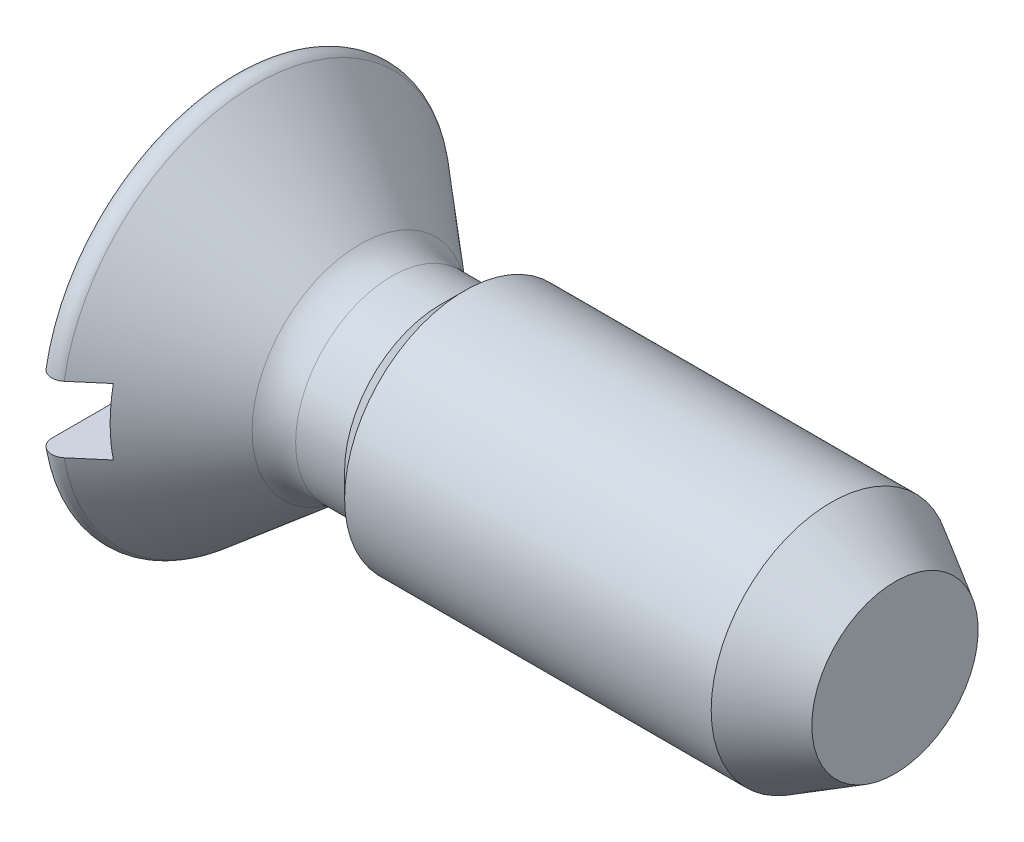
ISO-10303-21;
HEADER;
FILE_DESCRIPTION(('STEP AP214'),'2;1');
FILE_NAME('part.step','',(''),(''),'','','');
FILE_SCHEMA(('AUTOMOTIVE_DESIGN { 1 0 10303 214 1 1 1 1 }'));
ENDSEC;
DATA;
#1=APPLICATION_CONTEXT('core data for automotive mechanical design processes');
#2=APPLICATION_PROTOCOL_DEFINITION('international standard','automotive_design',2000,#1);
#3=PRODUCT_CONTEXT('',#1,'mechanical');
#4=PRODUCT('Part','Part','',(#3));
#5=PRODUCT_RELATED_PRODUCT_CATEGORY('part','',(#4));
#6=PRODUCT_DEFINITION_FORMATION('','',#4);
#7=PRODUCT_DEFINITION_CONTEXT('part definition',#1,'design');
#8=PRODUCT_DEFINITION('design','',#6,#7);
#9=PRODUCT_DEFINITION_SHAPE('','',#8);
#10=(LENGTH_UNIT() NAMED_UNIT(*) SI_UNIT(.MILLI.,.METRE.));
#11=(NAMED_UNIT(*) PLANE_ANGLE_UNIT() SI_UNIT($,.RADIAN.));
#12=(NAMED_UNIT(*) SI_UNIT($,.STERADIAN.) SOLID_ANGLE_UNIT());
#13=UNCERTAINTY_MEASURE_WITH_UNIT(LENGTH_MEASURE(1.E-05),#10,'distance_accuracy_value','');
#14=(GEOMETRIC_REPRESENTATION_CONTEXT(3) GLOBAL_UNCERTAINTY_ASSIGNED_CONTEXT((#13)) GLOBAL_UNIT_ASSIGNED_CONTEXT((#10,
#11,#12)) REPRESENTATION_CONTEXT('',''));
#15=CARTESIAN_POINT('',(0.,0.,0.));
#16=DIRECTION('',(0.,0.,1.));
#17=DIRECTION('',(1.,0.,0.));
#18=AXIS2_PLACEMENT_3D('',#15,#16,#17);
#19=CARTESIAN_POINT('',(0.,0.,0.));
#20=DIRECTION('',(-1.,0.,0.));
#21=DIRECTION('',(0.,0.,1.));
#22=AXIS2_PLACEMENT_3D('',#19,#20,#21);
#23=CYLINDRICAL_SURFACE('',#22,1.45);
#24=CARTESIAN_POINT('',(2.8,0.,0.));
#25=DIRECTION('',(-1.,0.,0.));
#26=DIRECTION('',(0.,0.,1.));
#27=AXIS2_PLACEMENT_3D('',#24,#25,#26);
#28=CIRCLE('',#27,1.45);
#29=CARTESIAN_POINT('',(2.8,0.,1.45));
#30=VERTEX_POINT('',#29);
#31=EDGE_CURVE('E207',#30,#30,#28,.T.);
#32=ORIENTED_EDGE('',*,*,#31,.F.);
#33=EDGE_LOOP('',(#32));
#34=FACE_BOUND('',#33,.T.);
#35=CARTESIAN_POINT('',(7.22923739063184,0.,0.));
#36=DIRECTION('',(-1.,0.,0.));
#37=DIRECTION('',(0.,0.,1.));
#38=AXIS2_PLACEMENT_3D('',#35,#36,#37);
#39=CIRCLE('',#38,1.45);
#40=CARTESIAN_POINT('',(7.22923739063184,0.,1.45));
#41=VERTEX_POINT('',#40);
#42=EDGE_CURVE('E322',#41,#41,#39,.T.);
#43=ORIENTED_EDGE('',*,*,#42,.T.);
#44=EDGE_LOOP('',(#43));
#45=FACE_BOUND('',#44,.T.);
#46=ADVANCED_FACE('F68',(#34,#45),#23,.T.);
#47=CARTESIAN_POINT('',(0.17,0.,0.));
#48=DIRECTION('',(-1.,0.,0.));
#49=DIRECTION('',(0.,0.,1.));
#50=AXIS2_PLACEMENT_3D('',#47,#48,#49);
#51=TOROIDAL_SURFACE('',#50,2.22190319651476,0.17);
#52=CARTESIAN_POINT('',(0.279273893646712,0.,0.));
#53=DIRECTION('',(-1.,0.,0.));
#54=DIRECTION('',(0.,0.,1.));
#55=AXIS2_PLACEMENT_3D('',#52,#53,#54);
#56=CIRCLE('',#55,2.35213075184498);
#57=CARTESIAN_POINT('',(0.279273893646822,0.4,2.31786951180939));
#58=VERTEX_POINT('',#57);
#59=CARTESIAN_POINT('',(0.279273893646712,0.4,-2.31786951180925));
#60=VERTEX_POINT('',#59);
#61=EDGE_CURVE('E195',#58,#60,#56,.T.);
#62=ORIENTED_EDGE('',*,*,#61,.T.);
#63=CARTESIAN_POINT('',(0.0889384961785329,0.4,-2.33735245315841));
#64=CARTESIAN_POINT('',(0.0805263654139206,0.4,-2.33272221499589));
#65=CARTESIAN_POINT('',(0.072502803363843,0.4,-2.32737032643383));
#66=CARTESIAN_POINT('',(0.0574658225928772,0.4,-2.31538584476536));
#67=CARTESIAN_POINT('',(0.0504537835014888,0.4,-2.30875153085024));
#68=CARTESIAN_POINT('',(0.0376460763453105,0.4,-2.29441026275131));
#69=CARTESIAN_POINT('',(0.0318490873155328,0.4,-2.28670448875177));
#70=CARTESIAN_POINT('',(0.0216166901804722,0.4,-2.27044028115566));
#71=CARTESIAN_POINT('',(0.0171809523346821,0.4,-2.26188205471794));
#72=CARTESIAN_POINT('',(0.00974088996505031,0.4,-2.24405535282024));
#73=CARTESIAN_POINT('',(0.00675261357868859,0.4,-2.23478018033097));
#74=CARTESIAN_POINT('',(0.00235416229051626,0.4,-2.21586245858979));
#75=CARTESIAN_POINT('',(0.000944168939626591,0.4,-2.20621986720534));
#76=CARTESIAN_POINT('',(-0.000271469793120033,0.4,-2.18671389355607));
#77=CARTESIAN_POINT('',(-5.7032249274555E-05,0.4,-2.17684925582097));
#78=CARTESIAN_POINT('',(0.00201640846432935,0.4,-2.15729406609383));
#79=CARTESIAN_POINT('',(0.00387548203202619,0.4,-2.14760352157189));
#80=CARTESIAN_POINT('',(0.00920170433124389,0.4,-2.12862529165873));
#81=CARTESIAN_POINT('',(0.0126763545484518,0.4,-2.11933970898794));
#82=CARTESIAN_POINT('',(0.0211446700937419,0.4,-2.10148865373612));
#83=CARTESIAN_POINT('',(0.0261383085428652,0.4,-2.09292316841618));
#84=CARTESIAN_POINT('',(0.0374749882434484,0.4,-2.07681720987948));
#85=CARTESIAN_POINT('',(0.0438093629401025,0.4,-2.06927064040772));
#86=CARTESIAN_POINT('',(0.0576733772891683,0.4,-2.05536898482295));
#87=CARTESIAN_POINT('',(0.0652029204841273,0.4,-2.04901380264784));
#88=CARTESIAN_POINT('',(0.0811188303905905,0.4,-2.03778408507649));
#89=CARTESIAN_POINT('',(0.0894899345399597,0.4,-2.03288792338717));
#90=CARTESIAN_POINT('',(0.106946537617095,0.4,-2.02460018274473));
#91=CARTESIAN_POINT('',(0.116031957326244,0.4,-2.02120843722602));
#92=CARTESIAN_POINT('',(0.134484532048687,0.4,-2.01608678532061));
#93=CARTESIAN_POINT('',(0.143843748365539,0.4,-2.01432825792454));
#94=CARTESIAN_POINT('',(0.162724652963433,0.4,-2.01242635488956));
#95=CARTESIAN_POINT('',(0.172246328895226,0.4,-2.01228285702835));
#96=CARTESIAN_POINT('',(0.191073946256289,0.4,-2.01360825815497));
#97=CARTESIAN_POINT('',(0.200381105718333,0.4,-2.01505994611846));
#98=CARTESIAN_POINT('',(0.218620285805626,0.4,-2.01950203041738));
#99=CARTESIAN_POINT('',(0.227552308041324,0.4,-2.02249242014648));
#100=CARTESIAN_POINT('',(0.244812707641328,0.4,-2.02992704705099));
#101=CARTESIAN_POINT('',(0.253139669277806,0.4,-2.03437456777238));
#102=CARTESIAN_POINT('',(0.268942283765914,0.4,-2.04458633866557));
#103=CARTESIAN_POINT('',(0.276417884388006,0.4,-2.05035066955627));
#104=CARTESIAN_POINT('',(0.290417775919704,0.4,-2.06311463419677));
#105=CARTESIAN_POINT('',(0.296927551771122,0.4,-2.0701301832642));
#106=CARTESIAN_POINT('',(0.308702093427808,0.4,-2.0851378411088));
#107=CARTESIAN_POINT('',(0.313966743727458,0.4,-2.09313004038192));
#108=CARTESIAN_POINT('',(0.323200485377303,0.4,-2.11001835691443));
#109=CARTESIAN_POINT('',(0.327144587019896,0.4,-2.11892814024014));
#110=CARTESIAN_POINT('',(0.333503876746316,0.4,-2.13727765237194));
#111=CARTESIAN_POINT('',(0.335918939472825,0.4,-2.1467174245598));
#112=CARTESIAN_POINT('',(0.339180053297898,0.4,-2.1659961445512));
#113=CARTESIAN_POINT('',(0.340004421726993,0.4,-2.17583876618829));
#114=CARTESIAN_POINT('',(0.339995542141485,0.4,-2.19552353828602));
#115=CARTESIAN_POINT('',(0.339162238148206,0.4,-2.20536568871952));
#116=CARTESIAN_POINT('',(0.33585124735711,0.4,-2.22480511429204));
#117=CARTESIAN_POINT('',(0.333367861166056,0.4,-2.234401420552));
#118=CARTESIAN_POINT('',(0.326813923462802,0.4,-2.25303623180166));
#119=CARTESIAN_POINT('',(0.322743408361803,0.4,-2.26207474958238));
#120=CARTESIAN_POINT('',(0.313157151172355,0.4,-2.27926625050789));
#121=CARTESIAN_POINT('',(0.307651848294169,0.4,-2.28742505166302));
#122=CARTESIAN_POINT('',(0.295331954029087,0.4,-2.30268608802754));
#123=CARTESIAN_POINT('',(0.288517452377763,0.4,-2.30978839559233));
#124=CARTESIAN_POINT('',(0.273871380749755,0.4,-2.32263037095252));
#125=CARTESIAN_POINT('',(0.266054946288835,0.4,-2.32838729878652));
#126=CARTESIAN_POINT('',(0.249555458103697,0.4,-2.33848453643122));
#127=CARTESIAN_POINT('',(0.240872510950785,0.4,-2.34282502016891));
#128=CARTESIAN_POINT('',(0.223020371649629,0.4,-2.34990283731963));
#129=CARTESIAN_POINT('',(0.213859929837689,0.4,-2.35266225138013));
#130=CARTESIAN_POINT('',(0.195201248205265,0.4,-2.35658830630157));
#131=CARTESIAN_POINT('',(0.185702942980054,0.4,-2.35775463702741));
#132=CARTESIAN_POINT('',(0.166731964206846,0.4,-2.3584543716564));
#133=CARTESIAN_POINT('',(0.157259809445203,0.4,-2.35800215478366));
#134=CARTESIAN_POINT('',(0.138535034037434,0.4,-2.35551039873897));
#135=CARTESIAN_POINT('',(0.129282151809123,0.4,-2.35347286036945));
#136=CARTESIAN_POINT('',(0.114841115565776,0.4,-2.34899264533662));
#137=CARTESIAN_POINT('',(0.109498357672064,0.4,-2.34703240855724));
#138=CARTESIAN_POINT('',(0.099037811787483,0.4,-2.34258328599303));
#139=CARTESIAN_POINT('',(0.0939200220691785,0.4,-2.34009440426829));
#140=CARTESIAN_POINT('',(0.0889384961785329,0.4,-2.33735245315841));
#141=B_SPLINE_CURVE_WITH_KNOTS('',3,(#63,#64,#65,#66,#67,#68,#69,#70,#71,#72,#73,#74,#75,#76,
#77,#78,#79,#80,#81,#82,#83,#84,#85,#86,#87,#88,#89,#90,#91,#92,#93,#94,#95,#96,#97,#98,#99,
#100,#101,#102,#103,#104,#105,#106,#107,#108,#109,#110,#111,#112,#113,#114,#115,#116,#117,#118,
#119,#120,#121,#122,#123,#124,#125,#126,#127,#128,#129,#130,#131,#132,#133,#134,#135,#136,#137,
#138,#139,#140),.UNSPECIFIED.,.T.,.F.,(4,2,2,2,2,2,2,2,2,2,2,2,2,2,2,2,2,2,2,2,2,2,2,2,2,2,2,2,
2,2,2,2,2,2,2,2,2,2,4),(0.,0.0287856022235971,0.0576101016420048,0.08640309952133,
0.115189117259417,0.144287371274258,0.173388972136262,0.202850939511252,0.23231416805412,
0.261915588502871,0.291516485175946,0.320931585396776,0.350344312843917,0.379296485599799,
0.408245452035222,0.436676967898712,0.465106332105879,0.493231947157433,0.521357441454472,
0.549546755656541,0.577737798294194,0.606316984159517,0.634898820169503,0.663994434386934,
0.693092433681682,0.722584339677379,0.75207724161525,0.781672545454371,0.811267170371229,
0.840652206997729,0.870035230222637,0.899017594352963,0.927996398361463,0.956559959293646,
0.985129080073548,1.01344502441606,1.04172528962806,1.05877178213366,1.07581814372351),.UNSPECIFIED.);
#142=CARTESIAN_POINT('',(0.,0.4,-2.18560147663806));
#143=VERTEX_POINT('',#142);
#144=EDGE_CURVE('E91',#60,#143,#141,.T.);
#145=ORIENTED_EDGE('',*,*,#144,.T.);
#146=CARTESIAN_POINT('',(0.,0.,0.));
#147=DIRECTION('',(-1.,0.,0.));
#148=DIRECTION('',(0.,0.,1.));
#149=AXIS2_PLACEMENT_3D('',#146,#147,#148);
#150=CIRCLE('',#149,2.22190319651476);
#151=CARTESIAN_POINT('',(0.,0.4,2.18560147663806));
#152=VERTEX_POINT('',#151);
#153=EDGE_CURVE('E191',#152,#143,#150,.T.);
#154=ORIENTED_EDGE('',*,*,#153,.F.);
#155=CARTESIAN_POINT('',(0.0607268239704161,0.4,2.05307195902255));
#156=CARTESIAN_POINT('',(0.0533325047271827,0.4,2.05939372510903));
#157=CARTESIAN_POINT('',(0.0464730494426978,0.4,2.06635324987246));
#158=CARTESIAN_POINT('',(0.0340187067438649,0.4,2.08133495441866));
#159=CARTESIAN_POINT('',(0.0284256438458081,0.4,2.08935864131829));
#160=CARTESIAN_POINT('',(0.018665170062593,0.4,2.10621894468746));
#161=CARTESIAN_POINT('',(0.0144961387682029,0.4,2.11505462255733));
#162=CARTESIAN_POINT('',(0.00768431113538374,0.4,2.13329240904059));
#163=CARTESIAN_POINT('',(0.00504111101541308,0.4,2.14269436707098));
#164=CARTESIAN_POINT('',(0.00132719351414438,0.4,2.16190667820539));
#165=CARTESIAN_POINT('',(0.000273282272579237,0.4,2.17172028336579));
#166=CARTESIAN_POINT('',(-0.000180002911596566,0.4,2.19138640573416));
#167=CARTESIAN_POINT('',(0.000420765714530454,0.4,2.20123892622208));
#168=CARTESIAN_POINT('',(0.00327010238288893,0.4,2.22074609081193));
#169=CARTESIAN_POINT('',(0.00552566903604959,0.4,2.23039971489531));
#170=CARTESIAN_POINT('',(0.0116358378968565,0.4,2.24918728316519));
#171=CARTESIAN_POINT('',(0.0154904029117863,0.4,2.25832123943355));
#172=CARTESIAN_POINT('',(0.0246673701311247,0.4,2.27574471880551));
#173=CARTESIAN_POINT('',(0.0299801773242239,0.4,2.2840392927509));
#174=CARTESIAN_POINT('',(0.0419406181108463,0.4,2.29960299856946));
#175=CARTESIAN_POINT('',(0.0485881579025156,0.4,2.30687220244213));
#176=CARTESIAN_POINT('',(0.0629350640803591,0.4,2.32007373878511));
#177=CARTESIAN_POINT('',(0.070619164675517,0.4,2.32602265934731));
#178=CARTESIAN_POINT('',(0.0868890858749922,0.4,2.33652365433732));
#179=CARTESIAN_POINT('',(0.0954748327676787,0.4,2.34107584283201));
#180=CARTESIAN_POINT('',(0.113171260830053,0.4,2.34858661287189));
#181=CARTESIAN_POINT('',(0.12227261879382,0.4,2.3515671677469));
#182=CARTESIAN_POINT('',(0.140848992966318,0.4,2.35594091253522));
#183=CARTESIAN_POINT('',(0.150323984977066,0.4,2.35733420507165));
#184=CARTESIAN_POINT('',(0.16927897732045,0.4,2.35848440332682));
#185=CARTESIAN_POINT('',(0.178758013718367,0.4,2.35825725290106));
#186=CARTESIAN_POINT('',(0.197542496129639,0.4,2.3562113067393));
#187=CARTESIAN_POINT('',(0.206847946254881,0.4,2.3543925487541));
#188=CARTESIAN_POINT('',(0.22500396204119,0.4,2.34922405823262));
#189=CARTESIAN_POINT('',(0.233855357455034,0.4,2.34587723768626));
#190=CARTESIAN_POINT('',(0.250875744757119,0.4,2.33775442867828));
#191=CARTESIAN_POINT('',(0.259044721825018,0.4,2.33297840918852));
#192=CARTESIAN_POINT('',(0.274528057099051,0.4,2.32210279289848));
#193=CARTESIAN_POINT('',(0.281836468935498,0.4,2.31599473400045));
#194=CARTESIAN_POINT('',(0.295340045780109,0.4,2.30265233010485));
#195=CARTESIAN_POINT('',(0.301535145157184,0.4,2.29541791875435));
#196=CARTESIAN_POINT('',(0.3127217442554,0.4,2.27993063913311));
#197=CARTESIAN_POINT('',(0.317696896773359,0.4,2.27166596512314));
#198=CARTESIAN_POINT('',(0.326211951104451,0.4,2.25442781238762));
#199=CARTESIAN_POINT('',(0.329751742387691,0.4,2.24545427913994));
#200=CARTESIAN_POINT('',(0.335348277572626,0.4,2.22691398298149));
#201=CARTESIAN_POINT('',(0.337382802543522,0.4,2.21734051112377));
#202=CARTESIAN_POINT('',(0.33983431031627,0.4,2.19798854449233));
#203=CARTESIAN_POINT('',(0.340251181511525,0.4,2.18821003561931));
#204=CARTESIAN_POINT('',(0.339454620762783,0.4,2.16861591174331));
#205=CARTESIAN_POINT('',(0.33822394258035,0.4,2.15880099365776));
#206=CARTESIAN_POINT('',(0.334135206871493,0.4,2.13951581862922));
#207=CARTESIAN_POINT('',(0.331277104805961,0.4,2.13004557112668));
#208=CARTESIAN_POINT('',(0.324003106794311,0.4,2.1117066008294));
#209=CARTESIAN_POINT('',(0.319584901145766,0.4,2.1028387932726));
#210=CARTESIAN_POINT('',(0.309308686863583,0.4,2.08598024647222));
#211=CARTESIAN_POINT('',(0.30345072875082,0.4,2.07798947646764));
#212=CARTESIAN_POINT('',(0.290516998683214,0.4,2.06319820480747));
#213=CARTESIAN_POINT('',(0.28345346832689,0.4,2.05638700465353));
#214=CARTESIAN_POINT('',(0.268265612053777,0.4,2.04407240585959));
#215=CARTESIAN_POINT('',(0.260141386637547,0.4,2.03856888345662));
#216=CARTESIAN_POINT('',(0.243212825070367,0.4,2.02912837063034));
#217=CARTESIAN_POINT('',(0.234422678332346,0.4,2.0251659378105));
#218=CARTESIAN_POINT('',(0.216294908587043,0.4,2.01880174061112));
#219=CARTESIAN_POINT('',(0.206957366278969,0.4,2.01639974681318));
#220=CARTESIAN_POINT('',(0.188167384306239,0.4,2.01326137051826));
#221=CARTESIAN_POINT('',(0.178719475516944,0.4,2.01249781271301));
#222=CARTESIAN_POINT('',(0.159828297491304,0.4,2.01258012030873));
#223=CARTESIAN_POINT('',(0.150385029569747,0.4,2.01342630933632));
#224=CARTESIAN_POINT('',(0.131839144701909,0.4,2.01668990906523));
#225=CARTESIAN_POINT('',(0.122734707365993,0.4,2.01909703373722));
#226=CARTESIAN_POINT('',(0.105063648328117,0.4,2.02539558879491));
#227=CARTESIAN_POINT('',(0.0964963882398251,0.4,2.02928521687507));
#228=CARTESIAN_POINT('',(0.083413424270796,0.4,2.03658971181166));
#229=CARTESIAN_POINT('',(0.0786498377931413,0.4,2.03957028316555));
#230=CARTESIAN_POINT('',(0.0694403878231822,0.4,2.04598707744135));
#231=CARTESIAN_POINT('',(0.0649945209951004,0.4,2.04942329557829));
#232=CARTESIAN_POINT('',(0.0607268239704161,0.4,2.05307195902255));
#233=B_SPLINE_CURVE_WITH_KNOTS('',3,(#155,#156,#157,#158,#159,#160,#161,#162,#163,#164,#165,
#166,#167,#168,#169,#170,#171,#172,#173,#174,#175,#176,#177,#178,#179,#180,#181,#182,#183,#184,
#185,#186,#187,#188,#189,#190,#191,#192,#193,#194,#195,#196,#197,#198,#199,#200,#201,#202,#203,
#204,#205,#206,#207,#208,#209,#210,#211,#212,#213,#214,#215,#216,#217,#218,#219,#220,#221,#222,
#223,#224,#225,#226,#227,#228,#229,#230,#231,#232),.UNSPECIFIED.,.T.,.F.,(4,2,2,2,2,2,2,2,2,2,2,
2,2,2,2,2,2,2,2,2,2,2,2,2,2,2,2,2,2,2,2,2,2,2,2,2,2,2,4),(0.,0.0291641226073472,
0.0583699989031383,0.0875425301726065,0.116707337955941,0.146178441755342,0.175652084891557,
0.205251104313015,0.234849435299611,0.264257498727385,0.293663496148858,0.322675986819382,
0.351686107496647,0.380279090733486,0.408870225209895,0.437180436678563,0.465489976685157,
0.49374579165871,0.522002220115276,0.550443673717503,0.578886803427513,0.607692462227106,
0.636500338783458,0.66572539364106,0.694952464783582,0.724487884049954,0.754024111676378,
0.783604251717249,0.813183353939945,0.842478258513248,0.871770389414233,0.900556010329154,
0.929337398174793,0.957637601431795,0.985943494817726,1.01406473194833,1.04215189008214,
1.05898439922184,1.075816731609),.UNSPECIFIED.);
#234=EDGE_CURVE('E140',#152,#58,#233,.T.);
#235=ORIENTED_EDGE('',*,*,#234,.T.);
#236=EDGE_LOOP('',(#62,#145,#154,#235));
#237=FACE_BOUND('',#236,.T.);
#238=ADVANCED_FACE('F219',(#237),#51,.T.);
#239=CARTESIAN_POINT('',(0.,0.,0.));
#240=DIRECTION('',(1.,0.,0.));
#241=DIRECTION('',(0.,0.,-1.));
#242=AXIS2_PLACEMENT_3D('',#239,#240,#241);
#243=PLANE('',#242);
#244=ORIENTED_EDGE('',*,*,#153,.T.);
#245=DIRECTION('',(0.,0.,1.));
#246=VECTOR('',#245,1.);
#247=CARTESIAN_POINT('',(0.,0.4,0.));
#248=LINE('',#247,#246);
#249=EDGE_CURVE('E211',#143,#152,#248,.T.);
#250=ORIENTED_EDGE('',*,*,#249,.T.);
#251=EDGE_LOOP('',(#244,#250));
#252=FACE_BOUND('',#251,.T.);
#253=ADVANCED_FACE('F224',(#252),#243,.F.);
#254=CARTESIAN_POINT('',(2.8,0.,0.));
#255=DIRECTION('',(1.,0.,0.));
#256=DIRECTION('',(0.,0.,-1.));
#257=AXIS2_PLACEMENT_3D('',#254,#255,#256);
#258=CONICAL_SURFACE('',#257,1.45,0.785398163397443);
#259=CARTESIAN_POINT('',(2.51,0.,0.));
#260=DIRECTION('',(-1.,0.,0.));
#261=DIRECTION('',(0.,0.,1.));
#262=AXIS2_PLACEMENT_3D('',#259,#260,#261);
#263=CIRCLE('',#262,1.16);
#264=CARTESIAN_POINT('',(2.51,0.,1.16));
#265=VERTEX_POINT('',#264);
#266=EDGE_CURVE('E204',#265,#265,#263,.T.);
#267=ORIENTED_EDGE('',*,*,#266,.F.);
#268=EDGE_LOOP('',(#267));
#269=FACE_BOUND('',#268,.T.);
#270=ORIENTED_EDGE('',*,*,#31,.T.);
#271=EDGE_LOOP('',(#270));
#272=FACE_BOUND('',#271,.T.);
#273=ADVANCED_FACE('F235',(#269,#272),#258,.T.);
#274=CARTESIAN_POINT('',(0.,0.,0.));
#275=DIRECTION('',(-1.,0.,0.));
#276=DIRECTION('',(0.,0.,1.));
#277=AXIS2_PLACEMENT_3D('',#274,#275,#276);
#278=CYLINDRICAL_SURFACE('',#277,1.16);
#279=CARTESIAN_POINT('',(1.91838214055972,0.,0.));
#280=DIRECTION('',(-1.,0.,0.));
#281=DIRECTION('',(0.,0.,1.));
#282=AXIS2_PLACEMENT_3D('',#279,#280,#281);
#283=CIRCLE('',#282,1.16);
#284=CARTESIAN_POINT('',(1.91838214055972,0.,1.16));
#285=VERTEX_POINT('',#284);
#286=EDGE_CURVE('E201',#285,#285,#283,.T.);
#287=ORIENTED_EDGE('',*,*,#286,.F.);
#288=EDGE_LOOP('',(#287));
#289=FACE_BOUND('',#288,.T.);
#290=ORIENTED_EDGE('',*,*,#266,.T.);
#291=EDGE_LOOP('',(#290));
#292=FACE_BOUND('',#291,.T.);
#293=ADVANCED_FACE('F238',(#289,#292),#278,.T.);
#294=CARTESIAN_POINT('',(1.91838214055972,0.,0.));
#295=DIRECTION('',(-1.,0.,0.));
#296=DIRECTION('',(0.,0.,1.));
#297=AXIS2_PLACEMENT_3D('',#294,#295,#296);
#298=TOROIDAL_SURFACE('',#297,1.76,0.6);
#299=CARTESIAN_POINT('',(1.5327095747478,0.,0.));
#300=DIRECTION('',(-1.,0.,0.));
#301=DIRECTION('',(0.,0.,1.));
#302=AXIS2_PLACEMENT_3D('',#299,#300,#301);
#303=CIRCLE('',#302,1.30037333412861);
#304=CARTESIAN_POINT('',(1.5327095747478,0.,1.30037333412861));
#305=VERTEX_POINT('',#304);
#306=EDGE_CURVE('E198',#305,#305,#303,.T.);
#307=ORIENTED_EDGE('',*,*,#306,.F.);
#308=EDGE_LOOP('',(#307));
#309=FACE_BOUND('',#308,.T.);
#310=ORIENTED_EDGE('',*,*,#286,.T.);
#311=EDGE_LOOP('',(#310));
#312=FACE_BOUND('',#311,.T.);
#313=ADVANCED_FACE('F225',(#309,#312),#298,.F.);
#314=CARTESIAN_POINT('',(1.5327095747478,0.,0.));
#315=DIRECTION('',(-1.,0.,0.));
#316=DIRECTION('',(0.,0.,1.));
#317=AXIS2_PLACEMENT_3D('',#314,#315,#316);
#318=CONICAL_SURFACE('',#317,1.30037333412861,0.698131700797734);
#319=CARTESIAN_POINT('',(0.6,0.,0.));
#320=DIRECTION('',(1.,0.,0.));
#321=DIRECTION('',(0.,0.,-1.));
#322=AXIS2_PLACEMENT_3D('',#319,#320,#321);
#323=CIRCLE('',#322,2.08300959429501);
#324=CARTESIAN_POINT('',(0.6,-0.4,-2.04424288427894));
#325=VERTEX_POINT('',#324);
#326=CARTESIAN_POINT('',(0.6,0.4,-2.04424288427894));
#327=VERTEX_POINT('',#326);
#328=EDGE_CURVE('E42',#325,#327,#323,.T.);
#329=ORIENTED_EDGE('',*,*,#328,.T.);
#330=CARTESIAN_POINT('',(-2.55003532144954,0.4,4.7092457427566));
#331=CARTESIAN_POINT('',(-2.36866257521732,0.4,4.5565043132777));
#332=CARTESIAN_POINT('',(-2.18731269118371,0.4,4.40373570290201));
#333=CARTESIAN_POINT('',(-1.82468195160716,0.4,4.09811033332977));
#334=CARTESIAN_POINT('',(-1.64340109728912,0.4,3.94525357267996));
#335=CARTESIAN_POINT('',(-1.28082171544578,0.4,3.63932528397944));
#336=CARTESIAN_POINT('',(-1.09952325107672,0.4,3.48625368106877));
#337=CARTESIAN_POINT('',(-0.737074141824612,0.4,3.17994146794497));
#338=CARTESIAN_POINT('',(-0.555923494586526,0.4,3.02670086051966));
#339=CARTESIAN_POINT('',(-0.189959398145049,0.4,2.71665911142036));
#340=CARTESIAN_POINT('',(-0.00515084662384369,0.4,2.55985218844558));
#341=CARTESIAN_POINT('',(0.364085081675436,0.4,2.24577137652898));
#342=CARTESIAN_POINT('',(0.548512439671285,0.4,2.08849746546606));
#343=CARTESIAN_POINT('',(0.824542431480219,0.4,1.85195640177782));
#344=CARTESIAN_POINT('',(0.916430128268785,0.4,1.7730220520484));
#345=CARTESIAN_POINT('',(1.09992081222268,0.4,1.61482330616994));
#346=CARTESIAN_POINT('',(1.19152380040201,0.4,1.53555891119872));
#347=CARTESIAN_POINT('',(1.3742794712919,0.4,1.3765269339881));
#348=CARTESIAN_POINT('',(1.46543218899675,0.4,1.29675939198553));
#349=CARTESIAN_POINT('',(1.6470030009896,0.4,1.13639386526003));
#350=CARTESIAN_POINT('',(1.73742111956514,0.4,1.05579590819401));
#351=CARTESIAN_POINT('',(1.87608053505422,0.4,0.930016255372456));
#352=CARTESIAN_POINT('',(1.92481780673886,0.4,0.885382939160159));
#353=CARTESIAN_POINT('',(2.02165860615403,0.4,0.795391575034065));
#354=CARTESIAN_POINT('',(2.06976185598315,0.4,0.750033227418341));
#355=CARTESIAN_POINT('',(2.16493799811712,0.4,0.658198296257407));
#356=CARTESIAN_POINT('',(2.21201048065302,0.4,0.611721282877622));
#357=CARTESIAN_POINT('',(2.28114976759862,0.4,0.540600583023671));
#358=CARTESIAN_POINT('',(2.30394335368765,0.4,0.51666834922961));
#359=CARTESIAN_POINT('',(2.34882117339076,0.4,0.468150428512132));
#360=CARTESIAN_POINT('',(2.37090540106997,0.4,0.443564736124688));
#361=CARTESIAN_POINT('',(2.42240662756625,0.4,0.383816546850312));
#362=CARTESIAN_POINT('',(2.45135989408901,0.4,0.348237791706467));
#363=CARTESIAN_POINT('',(2.49190782247,0.4,0.292809308613907));
#364=CARTESIAN_POINT('',(2.50492952001735,0.4,0.274013617745955));
#365=CARTESIAN_POINT('',(2.52956992538366,0.4,0.235532550091741));
#366=CARTESIAN_POINT('',(2.54118993246303,0.4,0.215848020821306));
#367=CARTESIAN_POINT('',(2.56227212988303,0.4,0.175577609586345));
#368=CARTESIAN_POINT('',(2.57175475509144,0.4,0.155002722182707));
#369=CARTESIAN_POINT('',(2.5877391329499,0.4,0.112722335329828));
#370=CARTESIAN_POINT('',(2.59424657350416,0.4,0.0910190823327617));
#371=CARTESIAN_POINT('',(2.6032585557451,0.4,0.0463845485387372));
#372=CARTESIAN_POINT('',(2.60569842199631,0.4,0.0234393080587865));
#373=CARTESIAN_POINT('',(2.60576628272636,0.4,-0.022431770830841));
#374=CARTESIAN_POINT('',(2.6033991986834,0.4,-0.0453576050674547));
#375=CARTESIAN_POINT('',(2.59390530205469,0.4,-0.0930674868136688));
#376=CARTESIAN_POINT('',(2.58623358654003,0.4,-0.11773750110512));
#377=CARTESIAN_POINT('',(2.57196135345997,0.4,-0.153629957909727));
#378=CARTESIAN_POINT('',(2.56672423676768,0.4,-0.165440770311903));
#379=CARTESIAN_POINT('',(2.55550186709424,0.4,-0.188700811694882));
#380=CARTESIAN_POINT('',(2.54951679196653,0.4,-0.200150125826578));
#381=CARTESIAN_POINT('',(2.53108467358083,0.4,-0.233254330200442));
#382=CARTESIAN_POINT('',(2.51782350502142,0.4,-0.254452789611974));
#383=CARTESIAN_POINT('',(2.48984173022972,0.4,-0.295872460017024));
#384=CARTESIAN_POINT('',(2.47511946028394,0.4,-0.316092517058909));
#385=CARTESIAN_POINT('',(2.42940407312716,0.4,-0.375766748859517));
#386=CARTESIAN_POINT('',(2.39695105363703,0.4,-0.414092397329685));
#387=CARTESIAN_POINT('',(2.32979796854071,0.4,-0.48933768862654));
#388=CARTESIAN_POINT('',(2.29507894957792,0.4,-0.526239805988392));
#389=CARTESIAN_POINT('',(2.22456791296106,0.4,-0.598834999185732));
#390=CARTESIAN_POINT('',(2.18877858302514,0.4,-0.634530691032039));
#391=CARTESIAN_POINT('',(2.11724700488749,0.4,-0.704436671718617));
#392=CARTESIAN_POINT('',(2.08151972423027,0.4,-0.738662410081642));
#393=CARTESIAN_POINT('',(2.00959655396174,0.4,-0.806618912570794));
#394=CARTESIAN_POINT('',(1.97340065179563,0.4,-0.840349663383886));
#395=CARTESIAN_POINT('',(1.86431577187335,0.4,-0.941023387499486));
#396=CARTESIAN_POINT('',(1.7909400825087,0.4,-1.00743779552182));
#397=CARTESIAN_POINT('',(1.64339029782906,0.4,-1.13955245262369));
#398=CARTESIAN_POINT('',(1.56921533127887,0.4,-1.20525172251685));
#399=CARTESIAN_POINT('',(1.42042618135326,0.4,-1.33613828509369));
#400=CARTESIAN_POINT('',(1.34581203446292,0.4,-1.40132561928502));
#401=CARTESIAN_POINT('',(1.12295313212806,0.4,-1.59516793555162));
#402=CARTESIAN_POINT('',(0.974291523756311,0.4,-1.72334293701566));
#403=CARTESIAN_POINT('',(0.676484352042157,0.4,-1.97898426786859));
#404=CARTESIAN_POINT('',(0.527339051620331,0.4,-2.10645090448784));
#405=CARTESIAN_POINT('',(0.136342922030979,0.4,-2.43976405062162));
#406=CARTESIAN_POINT('',(-0.105767447008334,0.4,-2.64530601418247));
#407=CARTESIAN_POINT('',(-0.590430989298774,0.4,-3.05595827882286));
#408=CARTESIAN_POINT('',(-0.832984236823064,0.4,-3.26106849208756));
#409=CARTESIAN_POINT('',(-1.32122757568427,0.4,-3.67347534952788));
#410=CARTESIAN_POINT('',(-1.56692042014058,0.4,-3.88076873441951));
#411=CARTESIAN_POINT('',(-2.05840937137687,0.4,-4.29513674581692));
#412=CARTESIAN_POINT('',(-2.30420544905572,0.4,-4.50221140683539));
#413=CARTESIAN_POINT('',(-2.55003532144954,0.4,-4.70924574275661));
#414=B_SPLINE_CURVE_WITH_KNOTS('',3,(#330,#331,#332,#333,#334,#335,#336,#337,#338,#339,#340,
#341,#342,#343,#344,#345,#346,#347,#348,#349,#350,#351,#352,#353,#354,#355,#356,#357,#358,#359,
#360,#361,#362,#363,#364,#365,#366,#367,#368,#369,#370,#371,#372,#373,#374,#375,#376,#377,#378,
#379,#380,#381,#382,#383,#384,#385,#386,#387,#388,#389,#390,#391,#392,#393,#394,#395,#396,#397,
#398,#399,#400,#401,#402,#403,#404,#405,#406,#407,#408,#409,#410,#411,#412,#413),.UNSPECIFIED.,
.F.,.F.,(4,2,2,2,2,2,2,2,2,2,2,2,2,2,2,2,2,2,2,2,2,2,2,2,2,2,2,2,2,2,2,2,2,2,2,2,2,2,2,2,2,4),
(0.,0.711360808707476,1.42273370097049,2.1345625829187,2.84637989342963,3.57348591631901,
4.30062694972534,4.66403513110645,5.0274420167183,5.39082019998353,5.75418631983714,
5.95244162101843,6.15078110935931,6.34919806395183,6.44833523145142,6.54747322816746,
6.68491641870928,6.75347314430284,6.8219658265988,6.8897729167808,6.95744982689148,
7.02619289805066,7.09486562378584,7.17190735417371,7.21064990181749,7.24938325452368,
7.324295501987,7.39929405046881,7.54979223775328,7.70176989637735,7.85339355227756,
8.00181513162279,8.15024069558063,8.44713530795046,8.74439519965755,9.04163073545096,
9.63049121099724,10.2190724486787,11.1718479040517,12.1248013530049,13.089176500979,
14.0533654287015),.UNSPECIFIED.);
#415=EDGE_CURVE('E190',#327,#60,#414,.T.);
#416=ORIENTED_EDGE('',*,*,#415,.T.);
#417=ORIENTED_EDGE('',*,*,#61,.F.);
#418=CARTESIAN_POINT('',(0.6,0.4,2.04424288427894));
#419=VERTEX_POINT('',#418);
#420=EDGE_CURVE('E143',#58,#419,#414,.T.);
#421=ORIENTED_EDGE('',*,*,#420,.T.);
#422=CARTESIAN_POINT('',(0.6,-0.4,2.04424288427894));
#423=VERTEX_POINT('',#422);
#424=EDGE_CURVE('E72',#419,#423,#323,.T.);
#425=ORIENTED_EDGE('',*,*,#424,.T.);
#426=CARTESIAN_POINT('',(-2.55003532144954,-0.4,-4.7092457427566));
#427=CARTESIAN_POINT('',(-2.36866257521732,-0.4,-4.5565043132777));
#428=CARTESIAN_POINT('',(-2.18731269118371,-0.4,-4.40373570290201));
#429=CARTESIAN_POINT('',(-1.82468195160716,-0.4,-4.09811033332977));
#430=CARTESIAN_POINT('',(-1.64340109728912,-0.4,-3.94525357267996));
#431=CARTESIAN_POINT('',(-1.28082171544578,-0.4,-3.63932528397944));
#432=CARTESIAN_POINT('',(-1.09952325107672,-0.4,-3.48625368106877));
#433=CARTESIAN_POINT('',(-0.737074141824612,-0.4,-3.17994146794497));
#434=CARTESIAN_POINT('',(-0.555923494586526,-0.4,-3.02670086051966));
#435=CARTESIAN_POINT('',(-0.189959398145049,-0.4,-2.71665911142036));
#436=CARTESIAN_POINT('',(-0.00515084662384369,-0.4,-2.55985218844558));
#437=CARTESIAN_POINT('',(0.364085081675436,-0.4,-2.24577137652898));
#438=CARTESIAN_POINT('',(0.548512439671285,-0.4,-2.08849746546606));
#439=CARTESIAN_POINT('',(0.824542431480219,-0.4,-1.85195640177782));
#440=CARTESIAN_POINT('',(0.916430128268785,-0.4,-1.7730220520484));
#441=CARTESIAN_POINT('',(1.09992081222268,-0.4,-1.61482330616994));
#442=CARTESIAN_POINT('',(1.19152380040201,-0.4,-1.53555891119872));
#443=CARTESIAN_POINT('',(1.3742794712919,-0.4,-1.3765269339881));
#444=CARTESIAN_POINT('',(1.46543218899675,-0.4,-1.29675939198553));
#445=CARTESIAN_POINT('',(1.6470030009896,-0.4,-1.13639386526003));
#446=CARTESIAN_POINT('',(1.73742111956514,-0.4,-1.05579590819401));
#447=CARTESIAN_POINT('',(1.87608053505422,-0.4,-0.930016255372456));
#448=CARTESIAN_POINT('',(1.92481780673886,-0.4,-0.885382939160159));
#449=CARTESIAN_POINT('',(2.02165860615403,-0.4,-0.795391575034065));
#450=CARTESIAN_POINT('',(2.06976185598315,-0.4,-0.750033227418341));
#451=CARTESIAN_POINT('',(2.16493799811712,-0.4,-0.658198296257407));
#452=CARTESIAN_POINT('',(2.21201048065302,-0.4,-0.611721282877622));
#453=CARTESIAN_POINT('',(2.28114976759862,-0.4,-0.540600583023671));
#454=CARTESIAN_POINT('',(2.30394335368765,-0.4,-0.51666834922961));
#455=CARTESIAN_POINT('',(2.34882117339076,-0.4,-0.468150428512132));
#456=CARTESIAN_POINT('',(2.37090540106997,-0.4,-0.443564736124688));
#457=CARTESIAN_POINT('',(2.42240662756625,-0.4,-0.383816546850312));
#458=CARTESIAN_POINT('',(2.45135989408901,-0.4,-0.348237791706467));
#459=CARTESIAN_POINT('',(2.49190782247,-0.4,-0.292809308613907));
#460=CARTESIAN_POINT('',(2.50492952001735,-0.4,-0.274013617745955));
#461=CARTESIAN_POINT('',(2.52956992538366,-0.4,-0.235532550091741));
#462=CARTESIAN_POINT('',(2.54118993246303,-0.4,-0.215848020821306));
#463=CARTESIAN_POINT('',(2.56227212988303,-0.4,-0.175577609586345));
#464=CARTESIAN_POINT('',(2.57175475509144,-0.4,-0.155002722182707));
#465=CARTESIAN_POINT('',(2.5877391329499,-0.4,-0.112722335329828));
#466=CARTESIAN_POINT('',(2.59424657350416,-0.4,-0.0910190823327617));
#467=CARTESIAN_POINT('',(2.6032585557451,-0.4,-0.0463845485387372));
#468=CARTESIAN_POINT('',(2.60569842199631,-0.4,-0.0234393080587865));
#469=CARTESIAN_POINT('',(2.60576628272636,-0.4,0.022431770830841));
#470=CARTESIAN_POINT('',(2.6033991986834,-0.4,0.0453576050674547));
#471=CARTESIAN_POINT('',(2.59390530205469,-0.4,0.0930674868136688));
#472=CARTESIAN_POINT('',(2.58623358654003,-0.4,0.11773750110512));
#473=CARTESIAN_POINT('',(2.57196135345997,-0.4,0.153629957909727));
#474=CARTESIAN_POINT('',(2.56672423676768,-0.4,0.165440770311903));
#475=CARTESIAN_POINT('',(2.55550186709424,-0.4,0.188700811694882));
#476=CARTESIAN_POINT('',(2.54951679196653,-0.4,0.200150125826578));
#477=CARTESIAN_POINT('',(2.53108467358083,-0.4,0.233254330200442));
#478=CARTESIAN_POINT('',(2.51782350502142,-0.4,0.254452789611974));
#479=CARTESIAN_POINT('',(2.48984173022972,-0.4,0.295872460017024));
#480=CARTESIAN_POINT('',(2.47511946028394,-0.4,0.316092517058909));
#481=CARTESIAN_POINT('',(2.42940407312716,-0.4,0.375766748859517));
#482=CARTESIAN_POINT('',(2.39695105363703,-0.4,0.414092397329685));
#483=CARTESIAN_POINT('',(2.32979796854071,-0.4,0.48933768862654));
#484=CARTESIAN_POINT('',(2.29507894957792,-0.4,0.526239805988392));
#485=CARTESIAN_POINT('',(2.22456791296106,-0.4,0.598834999185732));
#486=CARTESIAN_POINT('',(2.18877858302514,-0.4,0.634530691032039));
#487=CARTESIAN_POINT('',(2.11724700488749,-0.4,0.704436671718617));
#488=CARTESIAN_POINT('',(2.08151972423027,-0.4,0.738662410081642));
#489=CARTESIAN_POINT('',(2.00959655396174,-0.4,0.806618912570794));
#490=CARTESIAN_POINT('',(1.97340065179563,-0.4,0.840349663383886));
#491=CARTESIAN_POINT('',(1.86431577187335,-0.4,0.941023387499486));
#492=CARTESIAN_POINT('',(1.7909400825087,-0.4,1.00743779552182));
#493=CARTESIAN_POINT('',(1.64339029782906,-0.4,1.13955245262369));
#494=CARTESIAN_POINT('',(1.56921533127887,-0.4,1.20525172251685));
#495=CARTESIAN_POINT('',(1.42042618135326,-0.4,1.33613828509369));
#496=CARTESIAN_POINT('',(1.34581203446292,-0.4,1.40132561928502));
#497=CARTESIAN_POINT('',(1.12295313212806,-0.4,1.59516793555162));
#498=CARTESIAN_POINT('',(0.974291523756311,-0.4,1.72334293701566));
#499=CARTESIAN_POINT('',(0.676484352042157,-0.4,1.97898426786859));
#500=CARTESIAN_POINT('',(0.527339051620331,-0.4,2.10645090448784));
#501=CARTESIAN_POINT('',(0.136342922030979,-0.4,2.43976405062162));
#502=CARTESIAN_POINT('',(-0.105767447008334,-0.4,2.64530601418247));
#503=CARTESIAN_POINT('',(-0.590430989298774,-0.4,3.05595827882286));
#504=CARTESIAN_POINT('',(-0.832984236823064,-0.4,3.26106849208756));
#505=CARTESIAN_POINT('',(-1.32122757568427,-0.4,3.67347534952788));
#506=CARTESIAN_POINT('',(-1.56692042014058,-0.4,3.88076873441951));
#507=CARTESIAN_POINT('',(-2.05840937137687,-0.4,4.29513674581692));
#508=CARTESIAN_POINT('',(-2.30420544905572,-0.4,4.50221140683539));
#509=CARTESIAN_POINT('',(-2.55003532144954,-0.4,4.70924574275661));
#510=B_SPLINE_CURVE_WITH_KNOTS('',3,(#426,#427,#428,#429,#430,#431,#432,#433,#434,#435,#436,
#437,#438,#439,#440,#441,#442,#443,#444,#445,#446,#447,#448,#449,#450,#451,#452,#453,#454,#455,
#456,#457,#458,#459,#460,#461,#462,#463,#464,#465,#466,#467,#468,#469,#470,#471,#472,#473,#474,
#475,#476,#477,#478,#479,#480,#481,#482,#483,#484,#485,#486,#487,#488,#489,#490,#491,#492,#493,
#494,#495,#496,#497,#498,#499,#500,#501,#502,#503,#504,#505,#506,#507,#508,#509),.UNSPECIFIED.,
.F.,.F.,(4,2,2,2,2,2,2,2,2,2,2,2,2,2,2,2,2,2,2,2,2,2,2,2,2,2,2,2,2,2,2,2,2,2,2,2,2,2,2,2,2,4),
(0.,0.711360808707476,1.42273370097049,2.1345625829187,2.84637989342963,3.57348591631901,
4.30062694972534,4.66403513110645,5.0274420167183,5.39082019998353,5.75418631983714,
5.95244162101843,6.15078110935931,6.34919806395183,6.44833523145142,6.54747322816746,
6.68491641870928,6.75347314430284,6.8219658265988,6.8897729167808,6.95744982689148,
7.02619289805066,7.09486562378584,7.17190735417371,7.21064990181749,7.24938325452368,
7.324295501987,7.39929405046881,7.54979223775328,7.70176989637735,7.85339355227756,
8.00181513162279,8.15024069558063,8.44713530795046,8.74439519965755,9.04163073545096,
9.63049121099724,10.2190724486787,11.1718479040517,12.1248013530049,13.089176500979,
14.0533654287015),.UNSPECIFIED.);
#511=CARTESIAN_POINT('',(0.279273893648982,-0.4,2.31786951181116));
#512=VERTEX_POINT('',#511);
#513=EDGE_CURVE('E132',#423,#512,#510,.T.);
#514=ORIENTED_EDGE('',*,*,#513,.T.);
#515=CARTESIAN_POINT('',(0.279273893657202,-0.4,-2.31786951181776));
#516=VERTEX_POINT('',#515);
#517=EDGE_CURVE('E139',#516,#512,#56,.T.);
#518=ORIENTED_EDGE('',*,*,#517,.F.);
#519=EDGE_CURVE('E130',#516,#325,#510,.T.);
#520=ORIENTED_EDGE('',*,*,#519,.T.);
#521=EDGE_LOOP('',(#329,#416,#417,#421,#425,#514,#518,#520));
#522=FACE_BOUND('',#521,.T.);
#523=ORIENTED_EDGE('',*,*,#306,.T.);
#524=EDGE_LOOP('',(#523));
#525=FACE_BOUND('',#524,.T.);
#526=ADVANCED_FACE('F136',(#522,#525),#318,.T.);
#527=CARTESIAN_POINT('',(0.,-0.4,-2.18560147663806));
#528=VERTEX_POINT('',#527);
#529=CARTESIAN_POINT('',(0.,-0.4,2.18560147663806));
#530=VERTEX_POINT('',#529);
#531=EDGE_CURVE('E194',#528,#530,#150,.T.);
#532=ORIENTED_EDGE('',*,*,#531,.F.);
#533=CARTESIAN_POINT('',(0.0889384961785329,-0.4,-2.33735245315841));
#534=CARTESIAN_POINT('',(0.0972123768332308,-0.4,-2.34190561278983));
#535=CARTESIAN_POINT('',(0.105874045892105,-0.4,-2.34576739468372));
#536=CARTESIAN_POINT('',(0.123729172481838,-0.4,-2.35198637705485));
#537=CARTESIAN_POINT('',(0.132923188690616,-0.4,-2.35434196444365));
#538=CARTESIAN_POINT('',(0.151575432191754,-0.4,-2.3574719573654));
#539=CARTESIAN_POINT('',(0.161033600340107,-0.4,-2.35824671401683));
#540=CARTESIAN_POINT('',(0.179942923272288,-0.4,-2.35819158079888));
#541=CARTESIAN_POINT('',(0.189394079162638,-0.4,-2.35736205624403));
#542=CARTESIAN_POINT('',(0.207995077960395,-0.4,-2.35412950616373));
#543=CARTESIAN_POINT('',(0.217145709452171,-0.4,-2.35173101405347));
#544=CARTESIAN_POINT('',(0.234917054845041,-0.4,-2.34543769373401));
#545=CARTESIAN_POINT('',(0.243537747163559,-0.4,-2.34154280462855));
#546=CARTESIAN_POINT('',(0.260043683767722,-0.4,-2.3323547572242));
#547=CARTESIAN_POINT('',(0.267925837677044,-0.4,-2.32705605006492));
#548=CARTESIAN_POINT('',(0.282701217295021,-0.4,-2.3152241984975));
#549=CARTESIAN_POINT('',(0.289594396017613,-0.4,-2.30869099547279));
#550=CARTESIAN_POINT('',(0.302280470306209,-0.4,-2.29449911647806));
#551=CARTESIAN_POINT('',(0.308060176993256,-0.4,-2.28682865393439));
#552=CARTESIAN_POINT('',(0.318271452791256,-0.4,-2.27063774199505));
#553=CARTESIAN_POINT('',(0.322702924387478,-0.4,-2.2621172311765));
#554=CARTESIAN_POINT('',(0.330159739539635,-0.4,-2.24433580513557));
#555=CARTESIAN_POINT('',(0.333163734893013,-0.4,-2.23506593660861));
#556=CARTESIAN_POINT('',(0.337594157317544,-0.4,-2.21615654721174));
#557=CARTESIAN_POINT('',(0.339020465329123,-0.4,-2.20651699850084));
#558=CARTESIAN_POINT('',(0.340269292940227,-0.4,-2.18701423289391));
#559=CARTESIAN_POINT('',(0.340071708008284,-0.4,-2.17714972467295));
#560=CARTESIAN_POINT('',(0.338031843842479,-0.4,-2.1575919546707));
#561=CARTESIAN_POINT('',(0.336189492192103,-0.4,-2.14789870044863));
#562=CARTESIAN_POINT('',(0.330896101077893,-0.4,-2.12891175867115));
#563=CARTESIAN_POINT('',(0.327437478709922,-0.4,-2.11962018257322));
#564=CARTESIAN_POINT('',(0.319000057254531,-0.4,-2.10175444507646));
#565=CARTESIAN_POINT('',(0.314021280944877,-0.4,-2.09318027293061));
#566=CARTESIAN_POINT('',(0.302712328532835,-0.4,-2.07705405447242));
#567=CARTESIAN_POINT('',(0.296390751202647,-0.4,-2.06949598197042));
#568=CARTESIAN_POINT('',(0.282550229504118,-0.4,-2.05556926504416));
#569=CARTESIAN_POINT('',(0.275031382948284,-0.4,-2.04920052354819));
#570=CARTESIAN_POINT('',(0.25913397889558,-0.4,-2.0379420232466));
#571=CARTESIAN_POINT('',(0.250770689167584,-0.4,-2.03303071122279));
#572=CARTESIAN_POINT('',(0.233326994036897,-0.4,-2.02471157284678));
#573=CARTESIAN_POINT('',(0.224246667804113,-0.4,-2.02130358078194));
#574=CARTESIAN_POINT('',(0.205801448708048,-0.4,-2.016149195872));
#575=CARTESIAN_POINT('',(0.196444551571577,-0.4,-2.01437417115664));
#576=CARTESIAN_POINT('',(0.177565449418603,-0.4,-2.01243921786672));
#577=CARTESIAN_POINT('',(0.168043257063133,-0.4,-2.01227916613296));
#578=CARTESIAN_POINT('',(0.149212383898242,-0.4,-2.01357208069676));
#579=CARTESIAN_POINT('',(0.139902508326364,-0.4,-2.01500773975896));
#580=CARTESIAN_POINT('',(0.121655281160066,-0.4,-2.01941855933484));
#581=CARTESIAN_POINT('',(0.112717927991799,-0.4,-2.02239371334369));
#582=CARTESIAN_POINT('',(0.0954450540248973,-0.4,-2.02979882120326));
#583=CARTESIAN_POINT('',(0.0871109009449758,-0.4,-2.03423196218237));
#584=CARTESIAN_POINT('',(0.0712916771493203,-0.4,-2.04441641541324));
#585=CARTESIAN_POINT('',(0.0638066573676611,-0.4,-2.05016780667596));
#586=CARTESIAN_POINT('',(0.04978615329657,-0.4,-2.062907220114));
#587=CARTESIAN_POINT('',(0.0432651106788743,-0.4,-2.06991113097457));
#588=CARTESIAN_POINT('',(0.0314662591964008,-0.4,-2.08489754092942));
#589=CARTESIAN_POINT('',(0.0261885680927317,-0.4,-2.09288013260838));
#590=CARTESIAN_POINT('',(0.0169270787946837,-0.4,-2.10975132890893));
#591=CARTESIAN_POINT('',(0.0129682442978349,-0.4,-2.11865364024458));
#592=CARTESIAN_POINT('',(0.00657838594964953,-0.4,-2.13699074265501));
#593=CARTESIAN_POINT('',(0.00414748943141587,-0.4,-2.14642557803714));
#594=CARTESIAN_POINT('',(0.000853676974750945,-0.4,-2.16569760803137));
#595=CARTESIAN_POINT('',(1.25290389972427E-05,-0.4,-2.17553852911307));
#596=CARTESIAN_POINT('',(-1.22509981504568E-05,-0.4,-2.19522238218067));
#597=CARTESIAN_POINT('',(0.000804112181296783,-0.4,-2.20506531416076));
#598=CARTESIAN_POINT('',(0.0040812232367912,-0.4,-2.22450867844017));
#599=CARTESIAN_POINT('',(0.00654759293466311,-0.4,-2.23410816483144));
#600=CARTESIAN_POINT('',(0.0130690435672311,-0.4,-2.25275472998948));
#601=CARTESIAN_POINT('',(0.0171244781804468,-0.4,-2.26180168526078));
#602=CARTESIAN_POINT('',(0.0266841004944444,-0.4,-2.27901638549386));
#603=CARTESIAN_POINT('',(0.0321786165439196,-0.4,-2.2871895053651));
#604=CARTESIAN_POINT('',(0.0444759633349059,-0.4,-2.30247291312152));
#605=CARTESIAN_POINT('',(0.0512771113448968,-0.4,-2.30958454732105));
#606=CARTESIAN_POINT('',(0.0632768285440479,-0.4,-2.32014427799687));
#607=CARTESIAN_POINT('',(0.068142742047724,-0.4,-2.32397683930238));
#608=CARTESIAN_POINT('',(0.0782631163391741,-0.4,-2.33108934360925));
#609=CARTESIAN_POINT('',(0.0835175738057124,-0.4,-2.3343692913335));
#610=CARTESIAN_POINT('',(0.0889384961785329,-0.4,-2.33735245315841));
#611=B_SPLINE_CURVE_WITH_KNOTS('',3,(#533,#534,#535,#536,#537,#538,#539,#540,#541,#542,#543,
#544,#545,#546,#547,#548,#549,#550,#551,#552,#553,#554,#555,#556,#557,#558,#559,#560,#561,#562,
#563,#564,#565,#566,#567,#568,#569,#570,#571,#572,#573,#574,#575,#576,#577,#578,#579,#580,#581,
#582,#583,#584,#585,#586,#587,#588,#589,#590,#591,#592,#593,#594,#595,#596,#597,#598,#599,#600,
#601,#602,#603,#604,#605,#606,#607,#608,#609,#610),.UNSPECIFIED.,.T.,.F.,(4,2,2,2,2,2,2,2,2,2,2,
2,2,2,2,2,2,2,2,2,2,2,2,2,2,2,2,2,2,2,2,2,2,2,2,2,2,2,4),(0.,0.0283095065066476,
0.0566492810746907,0.0849827604071848,0.113309788618196,0.141555327384833,0.169802015732747,
0.19816206486118,0.226523460925454,0.255202527846109,0.283883668564607,0.312981202160731,
0.34208093144139,0.371541466227354,0.401003298178717,0.430604762866869,0.460205784032745,
0.489622677535239,0.519037169017167,0.547992082459961,0.576943803371993,0.605377642019443,
0.633809312261919,0.661935593099531,0.690061755096065,0.718249813543144,0.746439561918509,
0.775016197550117,0.803595538663288,0.832688607826217,0.861784101184254,0.891275183716828,
0.920766182284411,0.950358176377242,0.979956760511118,1.00936130975034,1.03872824147927,
1.05727636360501,1.07582432720154),.UNSPECIFIED.);
#612=EDGE_CURVE('E83',#528,#516,#611,.T.);
#613=ORIENTED_EDGE('',*,*,#612,.T.);
#614=ORIENTED_EDGE('',*,*,#517,.T.);
#615=CARTESIAN_POINT('',(0.0607268239704161,-0.4,2.05307195902255));
#616=CARTESIAN_POINT('',(0.0679334396347803,-0.4,2.04691176424163));
#617=CARTESIAN_POINT('',(0.0756582474863808,-0.4,2.04134834041251));
#618=CARTESIAN_POINT('',(0.0919355946518063,-0.4,2.03158789656416));
#619=CARTESIAN_POINT('',(0.10048894273423,-0.4,2.02739222945736));
#620=CARTESIAN_POINT('',(0.118183475536789,-0.4,2.02050242443828));
#621=CARTESIAN_POINT('',(0.127324758014983,-0.4,2.01780853695619));
#622=CARTESIAN_POINT('',(0.145929873827406,-0.4,2.01401117905998));
#623=CARTESIAN_POINT('',(0.155393628402844,-0.4,2.0129073231153));
#624=CARTESIAN_POINT('',(0.174282393942994,-0.4,2.01232728073645));
#625=CARTESIAN_POINT('',(0.183706944811023,-0.4,2.01283603031875));
#626=CARTESIAN_POINT('',(0.20233600281028,-0.4,2.01543195903024));
#627=CARTESIAN_POINT('',(0.211540508190434,-0.4,2.01751915071602));
#628=CARTESIAN_POINT('',(0.229453451216827,-0.4,2.02320064012986));
#629=CARTESIAN_POINT('',(0.238162736508713,-0.4,2.02679226883007));
#630=CARTESIAN_POINT('',(0.254863801041245,-0.4,2.0353714055675));
#631=CARTESIAN_POINT('',(0.26285554996012,-0.4,2.04035897255788));
#632=CARTESIAN_POINT('',(0.27799098920606,-0.4,2.05164258102001));
#633=CARTESIAN_POINT('',(0.285124465535339,-0.4,2.05795231653083));
#634=CARTESIAN_POINT('',(0.298253635510179,-0.4,2.07166110081721));
#635=CARTESIAN_POINT('',(0.304249230634147,-0.4,2.07906024381894));
#636=CARTESIAN_POINT('',(0.31504487089449,-0.4,2.09487752200866));
#637=CARTESIAN_POINT('',(0.319821928130982,-0.4,2.10331134746679));
#638=CARTESIAN_POINT('',(0.327917667651325,-0.4,2.12085209580333));
#639=CARTESIAN_POINT('',(0.331236218501158,-0.4,2.12995907925734));
#640=CARTESIAN_POINT('',(0.336370765754915,-0.4,2.14874089198375));
#641=CARTESIAN_POINT('',(0.338162438813432,-0.4,2.15842237675996));
#642=CARTESIAN_POINT('',(0.340107234428375,-0.4,2.17794877488562));
#643=CARTESIAN_POINT('',(0.340260273322834,-0.4,2.18779369655379));
#644=CARTESIAN_POINT('',(0.338917037146974,-0.4,2.20743776751583));
#645=CARTESIAN_POINT('',(0.337409606710105,-0.4,2.21723615760634));
#646=CARTESIAN_POINT('',(0.332764340131088,-0.4,2.23643890540384));
#647=CARTESIAN_POINT('',(0.329626515982325,-0.4,2.24584326600881));
#648=CARTESIAN_POINT('',(0.321818038396336,-0.4,2.26394619522114));
#649=CARTESIAN_POINT('',(0.317153867280072,-0.4,2.2726475578743));
#650=CARTESIAN_POINT('',(0.306413560531014,-0.4,2.28913064231559));
#651=CARTESIAN_POINT('',(0.30033750928873,-0.4,2.29691241902705));
#652=CARTESIAN_POINT('',(0.287024153929114,-0.4,2.31123146222067));
#653=CARTESIAN_POINT('',(0.279802038828334,-0.4,2.31778284791377));
#654=CARTESIAN_POINT('',(0.264346336238333,-0.4,2.32955830485701));
#655=CARTESIAN_POINT('',(0.256112832469806,-0.4,2.33478248586076));
#656=CARTESIAN_POINT('',(0.238998302198228,-0.4,2.34367480230884));
#657=CARTESIAN_POINT('',(0.230128564919509,-0.4,2.34736466926808));
#658=CARTESIAN_POINT('',(0.211891138395023,-0.4,2.35318365243255));
#659=CARTESIAN_POINT('',(0.202523484564934,-0.4,2.35531287948365));
#660=CARTESIAN_POINT('',(0.183669389735171,-0.4,2.35792926621028));
#661=CARTESIAN_POINT('',(0.174185472002317,-0.4,2.35843463603566));
#662=CARTESIAN_POINT('',(0.155268398770629,-0.4,2.35783914491175));
#663=CARTESIAN_POINT('',(0.145835241572452,-0.4,2.35673833807349));
#664=CARTESIAN_POINT('',(0.127324968357989,-0.4,2.35297180995468));
#665=CARTESIAN_POINT('',(0.118246620985576,-0.4,2.35031213224633));
#666=CARTESIAN_POINT('',(0.100662255534603,-0.4,2.34351336853031));
#667=CARTESIAN_POINT('',(0.0921562435755837,-0.4,2.3393742667073));
#668=CARTESIAN_POINT('',(0.0759124812979246,-0.4,2.32971720541595));
#669=CARTESIAN_POINT('',(0.0681785559818113,-0.4,2.32419281525903));
#670=CARTESIAN_POINT('',(0.0537344437399865,-0.4,2.31193786543681));
#671=CARTESIAN_POINT('',(0.0470243115786376,-0.4,2.30520724128992));
#672=CARTESIAN_POINT('',(0.034733042696781,-0.4,2.29064854424934));
#673=CARTESIAN_POINT('',(0.0291659808430043,-0.4,2.28280859126688));
#674=CARTESIAN_POINT('',(0.0194049755759386,-0.4,2.26631619971537));
#675=CARTESIAN_POINT('',(0.0152111380111045,-0.4,2.25766369858105));
#676=CARTESIAN_POINT('',(0.00825157460133293,-0.4,2.23965686833569));
#677=CARTESIAN_POINT('',(0.00550756370326059,-0.4,2.23029414543595));
#678=CARTESIAN_POINT('',(0.00160975496007718,-0.4,2.2112436555184));
#679=CARTESIAN_POINT('',(0.000456013086655177,-0.4,2.20155587707212));
#680=CARTESIAN_POINT('',(-0.000238548384545067,-0.4,2.1820074733428));
#681=CARTESIAN_POINT('',(0.000239901797122539,-0.4,2.17214616002144));
#682=CARTESIAN_POINT('',(0.00283878198710304,-0.4,2.15263933989132));
#683=CARTESIAN_POINT('',(0.00495967600027823,-0.4,2.14299389485967));
#684=CARTESIAN_POINT('',(0.0108000671574034,-0.4,2.1241540770467));
#685=CARTESIAN_POINT('',(0.0145264853115889,-0.4,2.11496185139002));
#686=CARTESIAN_POINT('',(0.0234784814915465,-0.4,2.09734787146687));
#687=CARTESIAN_POINT('',(0.0287022534641023,-0.4,2.08892520503023));
#688=CARTESIAN_POINT('',(0.0384198688263937,-0.4,2.07588993152791));
#689=CARTESIAN_POINT('',(0.0425222125676776,-0.4,2.07098064081506));
#690=CARTESIAN_POINT('',(0.0512468323244227,-0.4,2.06164783864002));
#691=CARTESIAN_POINT('',(0.0558691047007768,-0.4,2.05722432377818));
#692=CARTESIAN_POINT('',(0.0607268239704161,-0.4,2.05307195902255));
#693=B_SPLINE_CURVE_WITH_KNOTS('',3,(#615,#616,#617,#618,#619,#620,#621,#622,#623,#624,#625,
#626,#627,#628,#629,#630,#631,#632,#633,#634,#635,#636,#637,#638,#639,#640,#641,#642,#643,#644,
#645,#646,#647,#648,#649,#650,#651,#652,#653,#654,#655,#656,#657,#658,#659,#660,#661,#662,#663,
#664,#665,#666,#667,#668,#669,#670,#671,#672,#673,#674,#675,#676,#677,#678,#679,#680,#681,#682,
#683,#684,#685,#686,#687,#688,#689,#690,#691,#692),.UNSPECIFIED.,.T.,.F.,(4,2,2,2,2,2,2,2,2,2,2,
2,2,2,2,2,2,2,2,2,2,2,2,2,2,2,2,2,2,2,2,2,2,2,2,2,2,2,4),(0.,0.0284192185148554,
0.056866463115277,0.0853184500357096,0.113763537119343,0.14194369321297,0.170124073483583,
0.19825466916954,0.22638645304394,0.254825441793961,0.283266891765332,0.312210710853725,
0.341157137694063,0.370556496479391,0.39995735626872,0.429556948255831,0.459156322507656,
0.488631586566384,0.518105089290695,0.547216374652356,0.576325251862968,0.605006507971822,
0.633685726770675,0.662042189720578,0.69039769738186,0.718643994259599,0.746890593105224,
0.775270825680648,0.803652575829078,0.832365224062462,0.861080084952896,0.890213637539068,
0.919348215494209,0.948827942978113,0.978316001784483,1.00793246836951,1.03751336190149,
1.0566698644885,1.07582623300283),.UNSPECIFIED.);
#694=EDGE_CURVE('E152',#512,#530,#693,.T.);
#695=ORIENTED_EDGE('',*,*,#694,.T.);
#696=EDGE_LOOP('',(#532,#613,#614,#695));
#697=FACE_BOUND('',#696,.T.);
#698=ADVANCED_FACE('F161',(#697),#51,.T.);
#699=ORIENTED_EDGE('',*,*,#531,.T.);
#700=DIRECTION('',(0.,0.,-1.));
#701=VECTOR('',#700,1.);
#702=CARTESIAN_POINT('',(0.,-0.4,0.));
#703=LINE('',#702,#701);
#704=EDGE_CURVE('E210',#530,#528,#703,.T.);
#705=ORIENTED_EDGE('',*,*,#704,.T.);
#706=EDGE_LOOP('',(#699,#705));
#707=FACE_BOUND('',#706,.T.);
#708=ADVANCED_FACE('F170',(#707),#243,.F.);
#709=CARTESIAN_POINT('',(0.6,0.4,-2.39190319651476));
#710=DIRECTION('',(1.,0.,0.));
#711=DIRECTION('',(0.,0.,-1.));
#712=AXIS2_PLACEMENT_3D('',#709,#710,#711);
#713=PLANE('',#712);
#714=DIRECTION('',(0.,0.,1.));
#715=VECTOR('',#714,1.);
#716=CARTESIAN_POINT('',(0.6,0.4,-2.39190319651476));
#717=LINE('',#716,#715);
#718=EDGE_CURVE('E126',#327,#419,#717,.T.);
#719=ORIENTED_EDGE('',*,*,#718,.F.);
#720=ORIENTED_EDGE('',*,*,#328,.F.);
#721=DIRECTION('',(0.,0.,1.));
#722=VECTOR('',#721,1.);
#723=CARTESIAN_POINT('',(0.6,-0.4,-2.39190319651476));
#724=LINE('',#723,#722);
#725=EDGE_CURVE('E123',#325,#423,#724,.T.);
#726=ORIENTED_EDGE('',*,*,#725,.T.);
#727=ORIENTED_EDGE('',*,*,#424,.F.);
#728=EDGE_LOOP('',(#719,#720,#726,#727));
#729=FACE_BOUND('',#728,.T.);
#730=ADVANCED_FACE('F122',(#729),#713,.F.);
#731=CARTESIAN_POINT('',(0.,0.4,-2.39190319651476));
#732=DIRECTION('',(0.,1.,0.));
#733=DIRECTION('',(0.,0.,1.));
#734=AXIS2_PLACEMENT_3D('',#731,#732,#733);
#735=PLANE('',#734);
#736=ORIENTED_EDGE('',*,*,#718,.T.);
#737=ORIENTED_EDGE('',*,*,#420,.F.);
#738=ORIENTED_EDGE('',*,*,#234,.F.);
#739=ORIENTED_EDGE('',*,*,#249,.F.);
#740=ORIENTED_EDGE('',*,*,#144,.F.);
#741=ORIENTED_EDGE('',*,*,#415,.F.);
#742=EDGE_LOOP('',(#736,#737,#738,#739,#740,#741));
#743=FACE_BOUND('',#742,.T.);
#744=ADVANCED_FACE('F168',(#743),#735,.F.);
#745=CARTESIAN_POINT('',(0.,-0.4,-2.39190319651476));
#746=DIRECTION('',(0.,-1.,0.));
#747=DIRECTION('',(0.,0.,-1.));
#748=AXIS2_PLACEMENT_3D('',#745,#746,#747);
#749=PLANE('',#748);
#750=ORIENTED_EDGE('',*,*,#612,.F.);
#751=ORIENTED_EDGE('',*,*,#704,.F.);
#752=ORIENTED_EDGE('',*,*,#694,.F.);
#753=ORIENTED_EDGE('',*,*,#513,.F.);
#754=ORIENTED_EDGE('',*,*,#725,.F.);
#755=ORIENTED_EDGE('',*,*,#519,.F.);
#756=EDGE_LOOP('',(#750,#751,#752,#753,#754,#755));
#757=FACE_BOUND('',#756,.T.);
#758=ADVANCED_FACE('F129',(#757),#749,.F.);
#759=CARTESIAN_POINT('',(7.22923739063184,0.,0.));
#760=DIRECTION('',(-1.,0.,0.));
#761=DIRECTION('',(0.,0.,1.));
#762=AXIS2_PLACEMENT_3D('',#759,#760,#761);
#763=CONICAL_SURFACE('',#762,1.45,0.523598775598293);
#764=CARTESIAN_POINT('',(8.,0.,0.));
#765=DIRECTION('',(-1.,0.,0.));
#766=DIRECTION('',(0.,0.,1.));
#767=AXIS2_PLACEMENT_3D('',#764,#765,#766);
#768=CIRCLE('',#767,1.005);
#769=CARTESIAN_POINT('',(8.,0.,1.005));
#770=VERTEX_POINT('',#769);
#771=EDGE_CURVE('E133',#770,#770,#768,.T.);
#772=ORIENTED_EDGE('',*,*,#771,.T.);
#773=EDGE_LOOP('',(#772));
#774=FACE_BOUND('',#773,.T.);
#775=ORIENTED_EDGE('',*,*,#42,.F.);
#776=EDGE_LOOP('',(#775));
#777=FACE_BOUND('',#776,.T.);
#778=ADVANCED_FACE('F167',(#774,#777),#763,.T.);
#779=CARTESIAN_POINT('',(8.,1.45,0.));
#780=DIRECTION('',(-1.,0.,0.));
#781=DIRECTION('',(0.,0.,1.));
#782=AXIS2_PLACEMENT_3D('',#779,#780,#781);
#783=PLANE('',#782);
#784=ORIENTED_EDGE('',*,*,#771,.F.);
#785=EDGE_LOOP('',(#784));
#786=FACE_BOUND('',#785,.T.);
#787=ADVANCED_FACE('F70',(#786),#783,.F.);
#788=CLOSED_SHELL('',(#46,#238,#253,#273,#293,#313,#526,#698,#708,#730,#744,#758,#778,#787));
#789=MANIFOLD_SOLID_BREP('B6',#788);
#790=ADVANCED_BREP_SHAPE_REPRESENTATION('',(#18,#789),#14);
#791=SHAPE_DEFINITION_REPRESENTATION(#9,#790);
ENDSEC;
END-ISO-10303-21;
